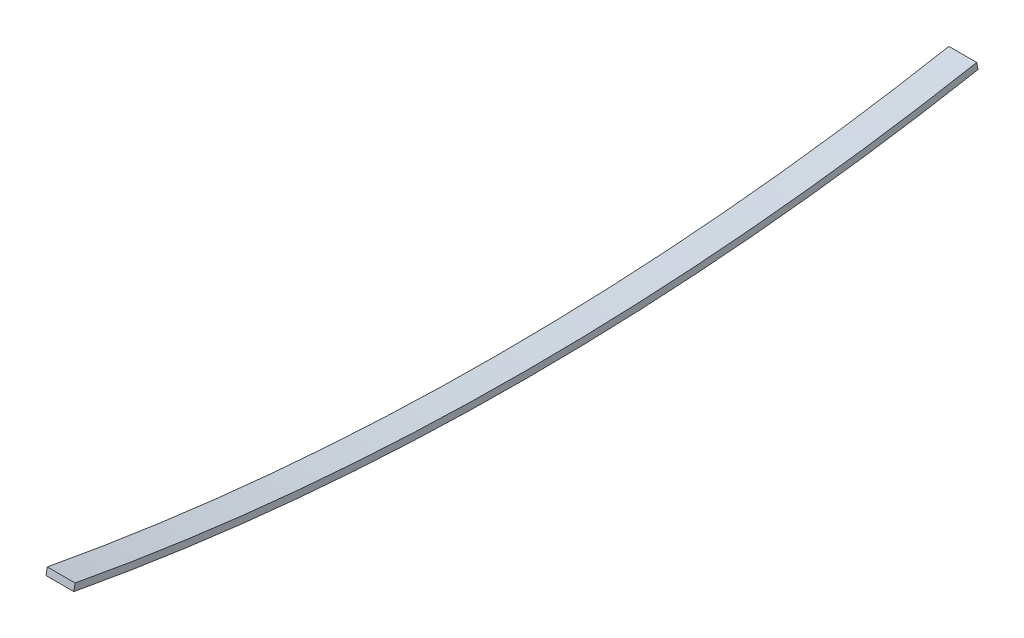
ISO-10303-21;
HEADER;
FILE_DESCRIPTION(('STEP AP214'),'2;1');
FILE_NAME('part.step','',(''),(''),'','','');
FILE_SCHEMA(('AUTOMOTIVE_DESIGN { 1 0 10303 214 1 1 1 1 }'));
ENDSEC;
DATA;
#1=APPLICATION_CONTEXT('core data for automotive mechanical design processes');
#2=APPLICATION_PROTOCOL_DEFINITION('international standard','automotive_design',2000,#1);
#3=PRODUCT_CONTEXT('',#1,'mechanical');
#4=PRODUCT('Part','Part','',(#3));
#5=PRODUCT_RELATED_PRODUCT_CATEGORY('part','',(#4));
#6=PRODUCT_DEFINITION_FORMATION('','',#4);
#7=PRODUCT_DEFINITION_CONTEXT('part definition',#1,'design');
#8=PRODUCT_DEFINITION('design','',#6,#7);
#9=PRODUCT_DEFINITION_SHAPE('','',#8);
#10=(LENGTH_UNIT() NAMED_UNIT(*) SI_UNIT(.MILLI.,.METRE.));
#11=(NAMED_UNIT(*) PLANE_ANGLE_UNIT() SI_UNIT($,.RADIAN.));
#12=(NAMED_UNIT(*) SI_UNIT($,.STERADIAN.) SOLID_ANGLE_UNIT());
#13=UNCERTAINTY_MEASURE_WITH_UNIT(LENGTH_MEASURE(1.E-05),#10,'distance_accuracy_value','');
#14=(GEOMETRIC_REPRESENTATION_CONTEXT(3) GLOBAL_UNCERTAINTY_ASSIGNED_CONTEXT((#13)) GLOBAL_UNIT_ASSIGNED_CONTEXT((#10,
#11,#12)) REPRESENTATION_CONTEXT('',''));
#15=CARTESIAN_POINT('',(0.,0.,0.));
#16=DIRECTION('',(0.,0.,1.));
#17=DIRECTION('',(1.,0.,0.));
#18=AXIS2_PLACEMENT_3D('',#15,#16,#17);
#19=CARTESIAN_POINT('',(2.,176.041666666667,0.));
#20=DIRECTION('',(-1.,0.,0.));
#21=DIRECTION('',(0.,0.,1.));
#22=AXIS2_PLACEMENT_3D('',#19,#20,#21);
#23=CYLINDRICAL_SURFACE('',#22,177.541666666667);
#24=CARTESIAN_POINT('',(0.,176.041666666667,0.));
#25=DIRECTION('',(1.,0.,0.));
#26=DIRECTION('',(0.,0.,-1.));
#27=AXIS2_PLACEMENT_3D('',#24,#25,#26);
#28=CIRCLE('',#27,177.541666666667);
#29=CARTESIAN_POINT('',(0.,1.50000000000003,32.5000000000001));
#30=VERTEX_POINT('',#29);
#31=CARTESIAN_POINT('',(0.,1.5,-32.4999999999999));
#32=VERTEX_POINT('',#31);
#33=EDGE_CURVE('E102',#30,#32,#28,.T.);
#34=ORIENTED_EDGE('',*,*,#33,.T.);
#35=DIRECTION('',(-1.,0.,0.));
#36=VECTOR('',#35,1.);
#37=CARTESIAN_POINT('',(2.,1.5,-32.4999999999999));
#38=LINE('',#37,#36);
#39=CARTESIAN_POINT('',(2.,1.5,-32.4999999999999));
#40=VERTEX_POINT('',#39);
#41=EDGE_CURVE('E11',#40,#32,#38,.T.);
#42=ORIENTED_EDGE('',*,*,#41,.F.);
#43=CARTESIAN_POINT('',(2.,176.041666666667,0.));
#44=DIRECTION('',(1.,0.,0.));
#45=DIRECTION('',(0.,0.,-1.));
#46=AXIS2_PLACEMENT_3D('',#43,#44,#45);
#47=CIRCLE('',#46,177.541666666667);
#48=CARTESIAN_POINT('',(2.,1.50000000000003,32.5000000000001));
#49=VERTEX_POINT('',#48);
#50=EDGE_CURVE('E79',#49,#40,#47,.T.);
#51=ORIENTED_EDGE('',*,*,#50,.F.);
#52=DIRECTION('',(-1.,0.,0.));
#53=VECTOR('',#52,1.);
#54=CARTESIAN_POINT('',(2.,1.50000000000003,32.5000000000001));
#55=LINE('',#54,#53);
#56=EDGE_CURVE('E55',#49,#30,#55,.T.);
#57=ORIENTED_EDGE('',*,*,#56,.T.);
#58=EDGE_LOOP('',(#34,#42,#51,#57));
#59=FACE_BOUND('',#58,.T.);
#60=ADVANCED_FACE('F39',(#59),#23,.T.);
#61=CARTESIAN_POINT('',(2.,1.99155127904249,-32.4084721896267));
#62=DIRECTION('',(0.,0.183055620746299,-0.983102558084958));
#63=DIRECTION('',(0.,0.983102558084958,0.183055620746299));
#64=AXIS2_PLACEMENT_3D('',#61,#62,#63);
#65=PLANE('',#64);
#66=DIRECTION('',(0.,-0.983102558084958,-0.183055620746299));
#67=VECTOR('',#66,1.);
#68=CARTESIAN_POINT('',(0.,1.99155127904249,-32.4084721896267));
#69=LINE('',#68,#67);
#70=CARTESIAN_POINT('',(0.,1.99155127904249,-32.4084721896267));
#71=VERTEX_POINT('',#70);
#72=EDGE_CURVE('E88',#71,#32,#69,.T.);
#73=ORIENTED_EDGE('',*,*,#72,.F.);
#74=DIRECTION('',(-1.,0.,0.));
#75=VECTOR('',#74,1.);
#76=CARTESIAN_POINT('',(2.,1.99155127904249,-32.4084721896267));
#77=LINE('',#76,#75);
#78=CARTESIAN_POINT('',(2.,1.99155127904249,-32.4084721896267));
#79=VERTEX_POINT('',#78);
#80=EDGE_CURVE('E47',#79,#71,#77,.T.);
#81=ORIENTED_EDGE('',*,*,#80,.F.);
#82=DIRECTION('',(0.,-0.983102558084958,-0.183055620746299));
#83=VECTOR('',#82,1.);
#84=CARTESIAN_POINT('',(2.,1.99155127904249,-32.4084721896267));
#85=LINE('',#84,#83);
#86=EDGE_CURVE('E86',#79,#40,#85,.T.);
#87=ORIENTED_EDGE('',*,*,#86,.T.);
#88=ORIENTED_EDGE('',*,*,#41,.T.);
#89=EDGE_LOOP('',(#73,#81,#87,#88));
#90=FACE_BOUND('',#89,.T.);
#91=ADVANCED_FACE('F85',(#90),#65,.T.);
#92=CARTESIAN_POINT('',(2.,176.041666666667,0.));
#93=DIRECTION('',(-1.,0.,0.));
#94=DIRECTION('',(0.,0.,1.));
#95=AXIS2_PLACEMENT_3D('',#92,#93,#94);
#96=CYLINDRICAL_SURFACE('',#95,177.041666666667);
#97=CARTESIAN_POINT('',(0.,176.041666666667,0.));
#98=DIRECTION('',(1.,0.,0.));
#99=DIRECTION('',(0.,0.,-1.));
#100=AXIS2_PLACEMENT_3D('',#97,#98,#99);
#101=CIRCLE('',#100,177.041666666667);
#102=CARTESIAN_POINT('',(0.,1.99155127904252,32.408472189627));
#103=VERTEX_POINT('',#102);
#104=EDGE_CURVE('E105',#103,#71,#101,.T.);
#105=ORIENTED_EDGE('',*,*,#104,.F.);
#106=DIRECTION('',(-1.,0.,0.));
#107=VECTOR('',#106,1.);
#108=CARTESIAN_POINT('',(2.,1.99155127904252,32.408472189627));
#109=LINE('',#108,#107);
#110=CARTESIAN_POINT('',(2.,1.99155127904252,32.408472189627));
#111=VERTEX_POINT('',#110);
#112=EDGE_CURVE('E68',#111,#103,#109,.T.);
#113=ORIENTED_EDGE('',*,*,#112,.F.);
#114=CARTESIAN_POINT('',(2.,176.041666666667,0.));
#115=DIRECTION('',(1.,0.,0.));
#116=DIRECTION('',(0.,0.,-1.));
#117=AXIS2_PLACEMENT_3D('',#114,#115,#116);
#118=CIRCLE('',#117,177.041666666667);
#119=EDGE_CURVE('E94',#111,#79,#118,.T.);
#120=ORIENTED_EDGE('',*,*,#119,.T.);
#121=ORIENTED_EDGE('',*,*,#80,.T.);
#122=EDGE_LOOP('',(#105,#113,#120,#121));
#123=FACE_BOUND('',#122,.T.);
#124=ADVANCED_FACE('F96',(#123),#96,.F.);
#125=CARTESIAN_POINT('',(2.,1.50000000000003,32.5000000000001));
#126=DIRECTION('',(0.,0.183055620746299,0.983102558084958));
#127=DIRECTION('',(0.,-0.983102558084958,0.183055620746299));
#128=AXIS2_PLACEMENT_3D('',#125,#126,#127);
#129=PLANE('',#128);
#130=DIRECTION('',(0.,0.983102558084958,-0.183055620746299));
#131=VECTOR('',#130,1.);
#132=CARTESIAN_POINT('',(0.,1.50000000000003,32.5000000000001));
#133=LINE('',#132,#131);
#134=EDGE_CURVE('E107',#30,#103,#133,.T.);
#135=ORIENTED_EDGE('',*,*,#134,.F.);
#136=ORIENTED_EDGE('',*,*,#56,.F.);
#137=DIRECTION('',(0.,0.983102558084958,-0.183055620746299));
#138=VECTOR('',#137,1.);
#139=CARTESIAN_POINT('',(2.,1.50000000000003,32.5000000000001));
#140=LINE('',#139,#138);
#141=EDGE_CURVE('E97',#49,#111,#140,.T.);
#142=ORIENTED_EDGE('',*,*,#141,.T.);
#143=ORIENTED_EDGE('',*,*,#112,.T.);
#144=EDGE_LOOP('',(#135,#136,#142,#143));
#145=FACE_BOUND('',#144,.T.);
#146=ADVANCED_FACE('F113',(#145),#129,.T.);
#147=CARTESIAN_POINT('',(2.,176.041666666667,0.));
#148=DIRECTION('',(1.,0.,0.));
#149=DIRECTION('',(0.,0.,-1.));
#150=AXIS2_PLACEMENT_3D('',#147,#148,#149);
#151=PLANE('',#150);
#152=ORIENTED_EDGE('',*,*,#50,.T.);
#153=ORIENTED_EDGE('',*,*,#86,.F.);
#154=ORIENTED_EDGE('',*,*,#119,.F.);
#155=ORIENTED_EDGE('',*,*,#141,.F.);
#156=EDGE_LOOP('',(#152,#153,#154,#155));
#157=FACE_BOUND('',#156,.T.);
#158=ADVANCED_FACE('F93',(#157),#151,.T.);
#159=CARTESIAN_POINT('',(0.,176.041666666667,0.));
#160=DIRECTION('',(1.,0.,0.));
#161=DIRECTION('',(0.,0.,-1.));
#162=AXIS2_PLACEMENT_3D('',#159,#160,#161);
#163=PLANE('',#162);
#164=ORIENTED_EDGE('',*,*,#33,.F.);
#165=ORIENTED_EDGE('',*,*,#134,.T.);
#166=ORIENTED_EDGE('',*,*,#104,.T.);
#167=ORIENTED_EDGE('',*,*,#72,.T.);
#168=EDGE_LOOP('',(#164,#165,#166,#167));
#169=FACE_BOUND('',#168,.T.);
#170=ADVANCED_FACE('F112',(#169),#163,.F.);
#171=CLOSED_SHELL('',(#60,#91,#124,#146,#158,#170));
#172=MANIFOLD_SOLID_BREP('B2',#171);
#173=ADVANCED_BREP_SHAPE_REPRESENTATION('',(#18,#172),#14);
#174=SHAPE_DEFINITION_REPRESENTATION(#9,#173);
ENDSEC;
END-ISO-10303-21;
